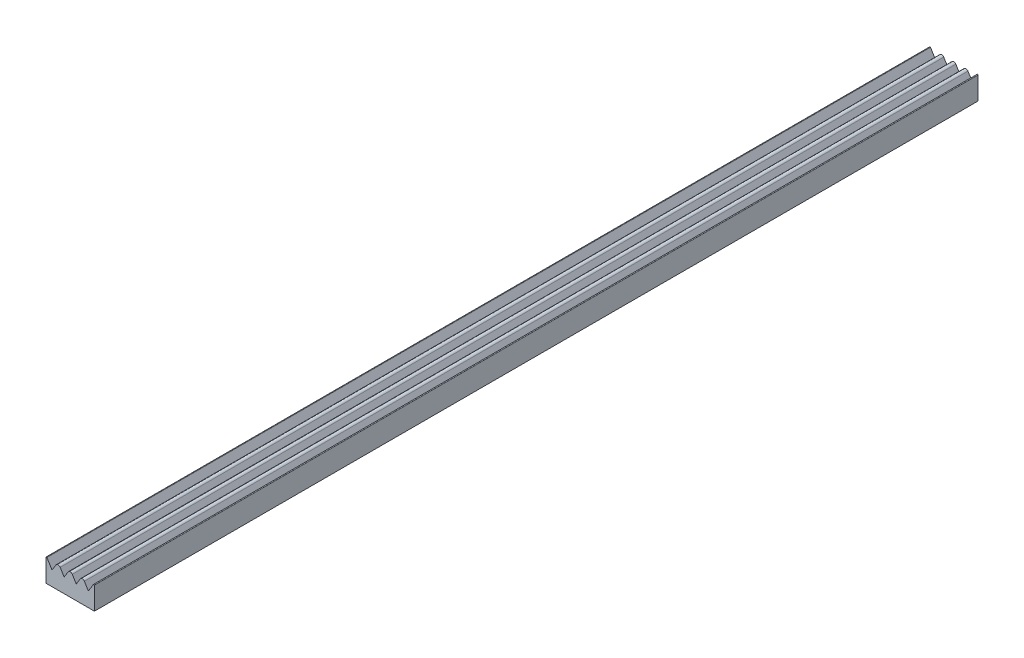
ISO-10303-21;
HEADER;
FILE_DESCRIPTION(('STEP AP214'),'2;1');
FILE_NAME('part.step','',(''),(''),'','','');
FILE_SCHEMA(('AUTOMOTIVE_DESIGN { 1 0 10303 214 1 1 1 1 }'));
ENDSEC;
DATA;
#1=APPLICATION_CONTEXT('core data for automotive mechanical design processes');
#2=APPLICATION_PROTOCOL_DEFINITION('international standard','automotive_design',2000,#1);
#3=PRODUCT_CONTEXT('',#1,'mechanical');
#4=PRODUCT('Part','Part','',(#3));
#5=PRODUCT_RELATED_PRODUCT_CATEGORY('part','',(#4));
#6=PRODUCT_DEFINITION_FORMATION('','',#4);
#7=PRODUCT_DEFINITION_CONTEXT('part definition',#1,'design');
#8=PRODUCT_DEFINITION('design','',#6,#7);
#9=PRODUCT_DEFINITION_SHAPE('','',#8);
#10=(LENGTH_UNIT() NAMED_UNIT(*) SI_UNIT(.MILLI.,.METRE.));
#11=(NAMED_UNIT(*) PLANE_ANGLE_UNIT() SI_UNIT($,.RADIAN.));
#12=(NAMED_UNIT(*) SI_UNIT($,.STERADIAN.) SOLID_ANGLE_UNIT());
#13=UNCERTAINTY_MEASURE_WITH_UNIT(LENGTH_MEASURE(1.E-05),#10,'distance_accuracy_value','');
#14=(GEOMETRIC_REPRESENTATION_CONTEXT(3) GLOBAL_UNCERTAINTY_ASSIGNED_CONTEXT((#13)) GLOBAL_UNIT_ASSIGNED_CONTEXT((#10,
#11,#12)) REPRESENTATION_CONTEXT('',''));
#15=CARTESIAN_POINT('',(0.,0.,0.));
#16=DIRECTION('',(0.,0.,1.));
#17=DIRECTION('',(1.,0.,0.));
#18=AXIS2_PLACEMENT_3D('',#15,#16,#17);
#19=CARTESIAN_POINT('',(0.,0.,231.775));
#20=DIRECTION('',(-1.,0.,0.));
#21=DIRECTION('',(0.,0.,1.));
#22=AXIS2_PLACEMENT_3D('',#19,#20,#21);
#23=PLANE('',#22);
#24=DIRECTION('',(0.,1.,0.));
#25=VECTOR('',#24,1.);
#26=CARTESIAN_POINT('',(0.,0.,0.));
#27=LINE('',#26,#25);
#28=CARTESIAN_POINT('',(0.,0.,0.));
#29=VERTEX_POINT('',#28);
#30=CARTESIAN_POINT('',(0.,5.90717687924576,0.));
#31=VERTEX_POINT('',#30);
#32=EDGE_CURVE('E177',#29,#31,#27,.T.);
#33=ORIENTED_EDGE('',*,*,#32,.T.);
#34=DIRECTION('',(0.,0.,-1.));
#35=VECTOR('',#34,1.);
#36=CARTESIAN_POINT('',(0.,5.90717687924576,231.775));
#37=LINE('',#36,#35);
#38=CARTESIAN_POINT('',(0.,5.90717687924576,231.775));
#39=VERTEX_POINT('',#38);
#40=EDGE_CURVE('E11',#39,#31,#37,.T.);
#41=ORIENTED_EDGE('',*,*,#40,.F.);
#42=DIRECTION('',(0.,1.,0.));
#43=VECTOR('',#42,1.);
#44=CARTESIAN_POINT('',(0.,0.,231.775));
#45=LINE('',#44,#43);
#46=CARTESIAN_POINT('',(0.,0.,231.775));
#47=VERTEX_POINT('',#46);
#48=EDGE_CURVE('E207',#47,#39,#45,.T.);
#49=ORIENTED_EDGE('',*,*,#48,.F.);
#50=DIRECTION('',(0.,0.,-1.));
#51=VECTOR('',#50,1.);
#52=CARTESIAN_POINT('',(0.,0.,231.775));
#53=LINE('',#52,#51);
#54=EDGE_CURVE('E173',#47,#29,#53,.T.);
#55=ORIENTED_EDGE('',*,*,#54,.T.);
#56=EDGE_LOOP('',(#33,#41,#49,#55));
#57=FACE_BOUND('',#56,.T.);
#58=ADVANCED_FACE('F33',(#57),#23,.F.);
#59=CARTESIAN_POINT('',(-0.127,5.90717687924576,231.775));
#60=DIRECTION('',(0.,0.,-1.));
#61=DIRECTION('',(-1.,0.,0.));
#62=AXIS2_PLACEMENT_3D('',#59,#60,#61);
#63=CYLINDRICAL_SURFACE('',#62,0.127);
#64=CARTESIAN_POINT('',(-0.127,5.90717687924576,0.));
#65=DIRECTION('',(0.,0.,1.));
#66=DIRECTION('',(1.,0.,0.));
#67=AXIS2_PLACEMENT_3D('',#64,#65,#66);
#68=CIRCLE('',#67,0.127);
#69=CARTESIAN_POINT('',(-0.234695784608649,5.97448674462616,0.));
#70=VERTEX_POINT('',#69);
#71=EDGE_CURVE('E180',#31,#70,#68,.T.);
#72=ORIENTED_EDGE('',*,*,#71,.T.);
#73=DIRECTION('',(0.,0.,-1.));
#74=VECTOR('',#73,1.);
#75=CARTESIAN_POINT('',(-0.234695784608649,5.97448674462616,231.775));
#76=LINE('',#75,#74);
#77=CARTESIAN_POINT('',(-0.234695784608649,5.97448674462616,231.775));
#78=VERTEX_POINT('',#77);
#79=EDGE_CURVE('E41',#78,#70,#76,.T.);
#80=ORIENTED_EDGE('',*,*,#79,.F.);
#81=CARTESIAN_POINT('',(-0.127,5.90717687924576,231.775));
#82=DIRECTION('',(0.,0.,1.));
#83=DIRECTION('',(1.,0.,0.));
#84=AXIS2_PLACEMENT_3D('',#81,#82,#83);
#85=CIRCLE('',#84,0.127);
#86=EDGE_CURVE('E116',#39,#78,#85,.T.);
#87=ORIENTED_EDGE('',*,*,#86,.F.);
#88=ORIENTED_EDGE('',*,*,#40,.T.);
#89=EDGE_LOOP('',(#72,#80,#87,#88));
#90=FACE_BOUND('',#89,.T.);
#91=ADVANCED_FACE('F305',(#90),#63,.T.);
#92=CARTESIAN_POINT('',(-1.5875,3.81,231.775));
#93=DIRECTION('',(0.847998304005088,-0.529998940003179,0.));
#94=DIRECTION('',(0.52999894000318,0.847998304005088,0.));
#95=AXIS2_PLACEMENT_3D('',#92,#93,#94);
#96=PLANE('',#95);
#97=DIRECTION('',(-0.529998940003179,-0.847998304005088,0.));
#98=VECTOR('',#97,1.);
#99=CARTESIAN_POINT('',(-1.5875,3.81,0.));
#100=LINE('',#99,#98);
#101=CARTESIAN_POINT('',(-1.5875,3.81,0.));
#102=VERTEX_POINT('',#101);
#103=EDGE_CURVE('E182',#70,#102,#100,.T.);
#104=ORIENTED_EDGE('',*,*,#103,.T.);
#105=DIRECTION('',(0.,0.,-1.));
#106=VECTOR('',#105,1.);
#107=CARTESIAN_POINT('',(-1.5875,3.81,231.775));
#108=LINE('',#107,#106);
#109=CARTESIAN_POINT('',(-1.5875,3.81,231.775));
#110=VERTEX_POINT('',#109);
#111=EDGE_CURVE('E238',#110,#102,#108,.T.);
#112=ORIENTED_EDGE('',*,*,#111,.F.);
#113=DIRECTION('',(-0.529998940003179,-0.847998304005088,0.));
#114=VECTOR('',#113,1.);
#115=CARTESIAN_POINT('',(-1.5875,3.81,231.775));
#116=LINE('',#115,#114);
#117=EDGE_CURVE('E246',#78,#110,#116,.T.);
#118=ORIENTED_EDGE('',*,*,#117,.F.);
#119=ORIENTED_EDGE('',*,*,#79,.T.);
#120=EDGE_LOOP('',(#104,#112,#118,#119));
#121=FACE_BOUND('',#120,.T.);
#122=ADVANCED_FACE('F244',(#121),#96,.F.);
#123=CARTESIAN_POINT('',(-2.63652107695677,5.48843372313082,231.775));
#124=DIRECTION('',(-0.847998304005088,-0.52999894000318,0.));
#125=DIRECTION('',(0.52999894000318,-0.847998304005088,0.));
#126=AXIS2_PLACEMENT_3D('',#123,#124,#125);
#127=PLANE('',#126);
#128=DIRECTION('',(-0.52999894000318,0.847998304005088,0.));
#129=VECTOR('',#128,1.);
#130=CARTESIAN_POINT('',(-2.63652107695677,5.48843372313082,0.));
#131=LINE('',#130,#129);
#132=CARTESIAN_POINT('',(-2.63652107695677,5.48843372313082,0.));
#133=VERTEX_POINT('',#132);
#134=EDGE_CURVE('E184',#102,#133,#131,.T.);
#135=ORIENTED_EDGE('',*,*,#134,.T.);
#136=DIRECTION('',(0.,0.,-1.));
#137=VECTOR('',#136,1.);
#138=CARTESIAN_POINT('',(-2.63652107695677,5.48843372313082,231.775));
#139=LINE('',#138,#137);
#140=CARTESIAN_POINT('',(-2.63652107695677,5.48843372313082,231.775));
#141=VERTEX_POINT('',#140);
#142=EDGE_CURVE('E235',#141,#133,#139,.T.);
#143=ORIENTED_EDGE('',*,*,#142,.F.);
#144=DIRECTION('',(-0.52999894000318,0.847998304005088,0.));
#145=VECTOR('',#144,1.);
#146=CARTESIAN_POINT('',(-2.63652107695677,5.48843372313082,231.775));
#147=LINE('',#146,#145);
#148=EDGE_CURVE('E264',#110,#141,#147,.T.);
#149=ORIENTED_EDGE('',*,*,#148,.F.);
#150=ORIENTED_EDGE('',*,*,#111,.T.);
#151=EDGE_LOOP('',(#135,#143,#149,#150));
#152=FACE_BOUND('',#151,.T.);
#153=ADVANCED_FACE('F255',(#152),#127,.F.);
#154=CARTESIAN_POINT('',(-3.175,5.15188439622881,231.775));
#155=DIRECTION('',(0.,0.,-1.));
#156=DIRECTION('',(-1.,0.,0.));
#157=AXIS2_PLACEMENT_3D('',#154,#155,#156);
#158=CYLINDRICAL_SURFACE('',#157,0.635);
#159=CARTESIAN_POINT('',(-3.175,5.15188439622881,0.));
#160=DIRECTION('',(0.,0.,1.));
#161=DIRECTION('',(-1.,0.,0.));
#162=AXIS2_PLACEMENT_3D('',#159,#160,#161);
#163=CIRCLE('',#162,0.635);
#164=CARTESIAN_POINT('',(-3.71347892304324,5.48843372313082,0.));
#165=VERTEX_POINT('',#164);
#166=EDGE_CURVE('E186',#133,#165,#163,.T.);
#167=ORIENTED_EDGE('',*,*,#166,.T.);
#168=DIRECTION('',(0.,0.,-1.));
#169=VECTOR('',#168,1.);
#170=CARTESIAN_POINT('',(-3.71347892304324,5.48843372313082,231.775));
#171=LINE('',#170,#169);
#172=CARTESIAN_POINT('',(-3.71347892304324,5.48843372313082,231.775));
#173=VERTEX_POINT('',#172);
#174=EDGE_CURVE('E232',#173,#165,#171,.T.);
#175=ORIENTED_EDGE('',*,*,#174,.F.);
#176=CARTESIAN_POINT('',(-3.175,5.15188439622881,231.775));
#177=DIRECTION('',(0.,0.,1.));
#178=DIRECTION('',(-1.,0.,0.));
#179=AXIS2_PLACEMENT_3D('',#176,#177,#178);
#180=CIRCLE('',#179,0.635);
#181=EDGE_CURVE('E261',#141,#173,#180,.T.);
#182=ORIENTED_EDGE('',*,*,#181,.F.);
#183=ORIENTED_EDGE('',*,*,#142,.T.);
#184=EDGE_LOOP('',(#167,#175,#182,#183));
#185=FACE_BOUND('',#184,.T.);
#186=ADVANCED_FACE('F259',(#185),#158,.T.);
#187=CARTESIAN_POINT('',(-4.7625,3.81,231.775));
#188=DIRECTION('',(0.847998304005088,-0.52999894000318,0.));
#189=DIRECTION('',(0.52999894000318,0.847998304005088,0.));
#190=AXIS2_PLACEMENT_3D('',#187,#188,#189);
#191=PLANE('',#190);
#192=DIRECTION('',(-0.52999894000318,-0.847998304005088,0.));
#193=VECTOR('',#192,1.);
#194=CARTESIAN_POINT('',(-4.7625,3.81,0.));
#195=LINE('',#194,#193);
#196=CARTESIAN_POINT('',(-4.7625,3.81,0.));
#197=VERTEX_POINT('',#196);
#198=EDGE_CURVE('E188',#165,#197,#195,.T.);
#199=ORIENTED_EDGE('',*,*,#198,.T.);
#200=DIRECTION('',(0.,0.,-1.));
#201=VECTOR('',#200,1.);
#202=CARTESIAN_POINT('',(-4.7625,3.81,231.775));
#203=LINE('',#202,#201);
#204=CARTESIAN_POINT('',(-4.7625,3.81,231.775));
#205=VERTEX_POINT('',#204);
#206=EDGE_CURVE('E229',#205,#197,#203,.T.);
#207=ORIENTED_EDGE('',*,*,#206,.F.);
#208=DIRECTION('',(-0.52999894000318,-0.847998304005088,0.));
#209=VECTOR('',#208,1.);
#210=CARTESIAN_POINT('',(-4.7625,3.81,231.775));
#211=LINE('',#210,#209);
#212=EDGE_CURVE('E263',#173,#205,#211,.T.);
#213=ORIENTED_EDGE('',*,*,#212,.F.);
#214=ORIENTED_EDGE('',*,*,#174,.T.);
#215=EDGE_LOOP('',(#199,#207,#213,#214));
#216=FACE_BOUND('',#215,.T.);
#217=ADVANCED_FACE('F318',(#216),#191,.F.);
#218=CARTESIAN_POINT('',(-4.7625,3.81,231.775));
#219=DIRECTION('',(-0.847998304005088,-0.52999894000318,0.));
#220=DIRECTION('',(0.52999894000318,-0.847998304005088,0.));
#221=AXIS2_PLACEMENT_3D('',#218,#219,#220);
#222=PLANE('',#221);
#223=DIRECTION('',(-0.52999894000318,0.847998304005088,0.));
#224=VECTOR('',#223,1.);
#225=CARTESIAN_POINT('',(-4.7625,3.81,0.));
#226=LINE('',#225,#224);
#227=CARTESIAN_POINT('',(-5.81152107695676,5.48843372313082,0.));
#228=VERTEX_POINT('',#227);
#229=EDGE_CURVE('E190',#197,#228,#226,.T.);
#230=ORIENTED_EDGE('',*,*,#229,.T.);
#231=DIRECTION('',(0.,0.,-1.));
#232=VECTOR('',#231,1.);
#233=CARTESIAN_POINT('',(-5.81152107695676,5.48843372313082,231.775));
#234=LINE('',#233,#232);
#235=CARTESIAN_POINT('',(-5.81152107695676,5.48843372313082,231.775));
#236=VERTEX_POINT('',#235);
#237=EDGE_CURVE('E226',#236,#228,#234,.T.);
#238=ORIENTED_EDGE('',*,*,#237,.F.);
#239=DIRECTION('',(-0.52999894000318,0.847998304005088,0.));
#240=VECTOR('',#239,1.);
#241=CARTESIAN_POINT('',(-4.7625,3.81,231.775));
#242=LINE('',#241,#240);
#243=EDGE_CURVE('E266',#205,#236,#242,.T.);
#244=ORIENTED_EDGE('',*,*,#243,.F.);
#245=ORIENTED_EDGE('',*,*,#206,.T.);
#246=EDGE_LOOP('',(#230,#238,#244,#245));
#247=FACE_BOUND('',#246,.T.);
#248=ADVANCED_FACE('F321',(#247),#222,.F.);
#249=CARTESIAN_POINT('',(-6.35,5.15188439622881,231.775));
#250=DIRECTION('',(0.,0.,-1.));
#251=DIRECTION('',(-1.,0.,0.));
#252=AXIS2_PLACEMENT_3D('',#249,#250,#251);
#253=CYLINDRICAL_SURFACE('',#252,0.635);
#254=CARTESIAN_POINT('',(-6.35,5.15188439622881,0.));
#255=DIRECTION('',(0.,0.,1.));
#256=DIRECTION('',(-1.,0.,0.));
#257=AXIS2_PLACEMENT_3D('',#254,#255,#256);
#258=CIRCLE('',#257,0.635);
#259=CARTESIAN_POINT('',(-6.88847892304323,5.48843372313082,0.));
#260=VERTEX_POINT('',#259);
#261=EDGE_CURVE('E192',#228,#260,#258,.T.);
#262=ORIENTED_EDGE('',*,*,#261,.T.);
#263=DIRECTION('',(0.,0.,-1.));
#264=VECTOR('',#263,1.);
#265=CARTESIAN_POINT('',(-6.88847892304323,5.48843372313082,231.775));
#266=LINE('',#265,#264);
#267=CARTESIAN_POINT('',(-6.88847892304323,5.48843372313082,231.775));
#268=VERTEX_POINT('',#267);
#269=EDGE_CURVE('E223',#268,#260,#266,.T.);
#270=ORIENTED_EDGE('',*,*,#269,.F.);
#271=CARTESIAN_POINT('',(-6.35,5.15188439622881,231.775));
#272=DIRECTION('',(0.,0.,1.));
#273=DIRECTION('',(-1.,0.,0.));
#274=AXIS2_PLACEMENT_3D('',#271,#272,#273);
#275=CIRCLE('',#274,0.635);
#276=EDGE_CURVE('E272',#236,#268,#275,.T.);
#277=ORIENTED_EDGE('',*,*,#276,.F.);
#278=ORIENTED_EDGE('',*,*,#237,.T.);
#279=EDGE_LOOP('',(#262,#270,#277,#278));
#280=FACE_BOUND('',#279,.T.);
#281=ADVANCED_FACE('F325',(#280),#253,.T.);
#282=CARTESIAN_POINT('',(-7.9375,3.81,231.775));
#283=DIRECTION('',(0.847998304005088,-0.52999894000318,0.));
#284=DIRECTION('',(0.52999894000318,0.847998304005088,0.));
#285=AXIS2_PLACEMENT_3D('',#282,#283,#284);
#286=PLANE('',#285);
#287=DIRECTION('',(-0.52999894000318,-0.847998304005088,0.));
#288=VECTOR('',#287,1.);
#289=CARTESIAN_POINT('',(-7.9375,3.81,0.));
#290=LINE('',#289,#288);
#291=CARTESIAN_POINT('',(-7.9375,3.81,0.));
#292=VERTEX_POINT('',#291);
#293=EDGE_CURVE('E194',#260,#292,#290,.T.);
#294=ORIENTED_EDGE('',*,*,#293,.T.);
#295=DIRECTION('',(0.,0.,-1.));
#296=VECTOR('',#295,1.);
#297=CARTESIAN_POINT('',(-7.9375,3.81,231.775));
#298=LINE('',#297,#296);
#299=CARTESIAN_POINT('',(-7.9375,3.81,231.775));
#300=VERTEX_POINT('',#299);
#301=EDGE_CURVE('E220',#300,#292,#298,.T.);
#302=ORIENTED_EDGE('',*,*,#301,.F.);
#303=DIRECTION('',(-0.52999894000318,-0.847998304005088,0.));
#304=VECTOR('',#303,1.);
#305=CARTESIAN_POINT('',(-7.9375,3.81,231.775));
#306=LINE('',#305,#304);
#307=EDGE_CURVE('E274',#268,#300,#306,.T.);
#308=ORIENTED_EDGE('',*,*,#307,.F.);
#309=ORIENTED_EDGE('',*,*,#269,.T.);
#310=EDGE_LOOP('',(#294,#302,#308,#309));
#311=FACE_BOUND('',#310,.T.);
#312=ADVANCED_FACE('F329',(#311),#286,.F.);
#313=CARTESIAN_POINT('',(-7.9375,3.81,231.775));
#314=DIRECTION('',(-0.847998304005088,-0.52999894000318,0.));
#315=DIRECTION('',(0.52999894000318,-0.847998304005088,0.));
#316=AXIS2_PLACEMENT_3D('',#313,#314,#315);
#317=PLANE('',#316);
#318=DIRECTION('',(-0.52999894000318,0.847998304005088,0.));
#319=VECTOR('',#318,1.);
#320=CARTESIAN_POINT('',(-7.9375,3.81,0.));
#321=LINE('',#320,#319);
#322=CARTESIAN_POINT('',(-8.98652107695676,5.48843372313082,0.));
#323=VERTEX_POINT('',#322);
#324=EDGE_CURVE('E196',#292,#323,#321,.T.);
#325=ORIENTED_EDGE('',*,*,#324,.T.);
#326=DIRECTION('',(0.,0.,-1.));
#327=VECTOR('',#326,1.);
#328=CARTESIAN_POINT('',(-8.98652107695676,5.48843372313082,231.775));
#329=LINE('',#328,#327);
#330=CARTESIAN_POINT('',(-8.98652107695676,5.48843372313082,231.775));
#331=VERTEX_POINT('',#330);
#332=EDGE_CURVE('E217',#331,#323,#329,.T.);
#333=ORIENTED_EDGE('',*,*,#332,.F.);
#334=DIRECTION('',(-0.52999894000318,0.847998304005088,0.));
#335=VECTOR('',#334,1.);
#336=CARTESIAN_POINT('',(-7.9375,3.81,231.775));
#337=LINE('',#336,#335);
#338=EDGE_CURVE('E276',#300,#331,#337,.T.);
#339=ORIENTED_EDGE('',*,*,#338,.F.);
#340=ORIENTED_EDGE('',*,*,#301,.T.);
#341=EDGE_LOOP('',(#325,#333,#339,#340));
#342=FACE_BOUND('',#341,.T.);
#343=ADVANCED_FACE('F333',(#342),#317,.F.);
#344=CARTESIAN_POINT('',(-9.525,5.15188439622881,231.775));
#345=DIRECTION('',(0.,0.,-1.));
#346=DIRECTION('',(-1.,0.,0.));
#347=AXIS2_PLACEMENT_3D('',#344,#345,#346);
#348=CYLINDRICAL_SURFACE('',#347,0.635);
#349=CARTESIAN_POINT('',(-9.525,5.15188439622881,0.));
#350=DIRECTION('',(0.,0.,1.));
#351=DIRECTION('',(1.,0.,0.));
#352=AXIS2_PLACEMENT_3D('',#349,#350,#351);
#353=CIRCLE('',#352,0.635);
#354=CARTESIAN_POINT('',(-10.0634789230432,5.48843372313082,0.));
#355=VERTEX_POINT('',#354);
#356=EDGE_CURVE('E198',#323,#355,#353,.T.);
#357=ORIENTED_EDGE('',*,*,#356,.T.);
#358=DIRECTION('',(0.,0.,-1.));
#359=VECTOR('',#358,1.);
#360=CARTESIAN_POINT('',(-10.0634789230432,5.48843372313082,231.775));
#361=LINE('',#360,#359);
#362=CARTESIAN_POINT('',(-10.0634789230432,5.48843372313082,231.775));
#363=VERTEX_POINT('',#362);
#364=EDGE_CURVE('E214',#363,#355,#361,.T.);
#365=ORIENTED_EDGE('',*,*,#364,.F.);
#366=CARTESIAN_POINT('',(-9.525,5.15188439622881,231.775));
#367=DIRECTION('',(0.,0.,1.));
#368=DIRECTION('',(1.,0.,0.));
#369=AXIS2_PLACEMENT_3D('',#366,#367,#368);
#370=CIRCLE('',#369,0.635);
#371=EDGE_CURVE('E278',#331,#363,#370,.T.);
#372=ORIENTED_EDGE('',*,*,#371,.F.);
#373=ORIENTED_EDGE('',*,*,#332,.T.);
#374=EDGE_LOOP('',(#357,#365,#372,#373));
#375=FACE_BOUND('',#374,.T.);
#376=ADVANCED_FACE('F337',(#375),#348,.T.);
#377=CARTESIAN_POINT('',(-10.0634789230432,5.48843372313082,231.775));
#378=DIRECTION('',(0.847998304005088,-0.52999894000318,0.));
#379=DIRECTION('',(0.52999894000318,0.847998304005088,0.));
#380=AXIS2_PLACEMENT_3D('',#377,#378,#379);
#381=PLANE('',#380);
#382=DIRECTION('',(-0.52999894000318,-0.847998304005088,0.));
#383=VECTOR('',#382,1.);
#384=CARTESIAN_POINT('',(-10.0634789230432,5.48843372313082,0.));
#385=LINE('',#384,#383);
#386=CARTESIAN_POINT('',(-11.1125,3.81,0.));
#387=VERTEX_POINT('',#386);
#388=EDGE_CURVE('E200',#355,#387,#385,.T.);
#389=ORIENTED_EDGE('',*,*,#388,.T.);
#390=DIRECTION('',(0.,0.,-1.));
#391=VECTOR('',#390,1.);
#392=CARTESIAN_POINT('',(-11.1125,3.81,231.775));
#393=LINE('',#392,#391);
#394=CARTESIAN_POINT('',(-11.1125,3.81,231.775));
#395=VERTEX_POINT('',#394);
#396=EDGE_CURVE('E211',#395,#387,#393,.T.);
#397=ORIENTED_EDGE('',*,*,#396,.F.);
#398=DIRECTION('',(-0.52999894000318,-0.847998304005088,0.));
#399=VECTOR('',#398,1.);
#400=CARTESIAN_POINT('',(-10.0634789230432,5.48843372313082,231.775));
#401=LINE('',#400,#399);
#402=EDGE_CURVE('E280',#363,#395,#401,.T.);
#403=ORIENTED_EDGE('',*,*,#402,.F.);
#404=ORIENTED_EDGE('',*,*,#364,.T.);
#405=EDGE_LOOP('',(#389,#397,#403,#404));
#406=FACE_BOUND('',#405,.T.);
#407=ADVANCED_FACE('F286',(#406),#381,.F.);
#408=CARTESIAN_POINT('',(-11.1125,3.81,231.775));
#409=DIRECTION('',(-0.847998304005088,-0.52999894000318,0.));
#410=DIRECTION('',(0.52999894000318,-0.847998304005088,0.));
#411=AXIS2_PLACEMENT_3D('',#408,#409,#410);
#412=PLANE('',#411);
#413=DIRECTION('',(-0.52999894000318,0.847998304005088,0.));
#414=VECTOR('',#413,1.);
#415=CARTESIAN_POINT('',(-11.1125,3.81,0.));
#416=LINE('',#415,#414);
#417=CARTESIAN_POINT('',(-12.4653042153914,5.97448674462616,0.));
#418=VERTEX_POINT('',#417);
#419=EDGE_CURVE('E202',#387,#418,#416,.T.);
#420=ORIENTED_EDGE('',*,*,#419,.T.);
#421=DIRECTION('',(0.,0.,-1.));
#422=VECTOR('',#421,1.);
#423=CARTESIAN_POINT('',(-12.4653042153914,5.97448674462616,231.775));
#424=LINE('',#423,#422);
#425=CARTESIAN_POINT('',(-12.4653042153914,5.97448674462616,231.775));
#426=VERTEX_POINT('',#425);
#427=EDGE_CURVE('E168',#426,#418,#424,.T.);
#428=ORIENTED_EDGE('',*,*,#427,.F.);
#429=DIRECTION('',(-0.52999894000318,0.847998304005088,0.));
#430=VECTOR('',#429,1.);
#431=CARTESIAN_POINT('',(-11.1125,3.81,231.775));
#432=LINE('',#431,#430);
#433=EDGE_CURVE('E159',#395,#426,#432,.T.);
#434=ORIENTED_EDGE('',*,*,#433,.F.);
#435=ORIENTED_EDGE('',*,*,#396,.T.);
#436=EDGE_LOOP('',(#420,#428,#434,#435));
#437=FACE_BOUND('',#436,.T.);
#438=ADVANCED_FACE('F290',(#437),#412,.F.);
#439=CARTESIAN_POINT('',(-12.573,5.90717687924576,231.775));
#440=DIRECTION('',(0.,0.,-1.));
#441=DIRECTION('',(-1.,0.,0.));
#442=AXIS2_PLACEMENT_3D('',#439,#440,#441);
#443=CYLINDRICAL_SURFACE('',#442,0.127);
#444=CARTESIAN_POINT('',(-12.573,5.90717687924576,0.));
#445=DIRECTION('',(0.,0.,1.));
#446=DIRECTION('',(1.,0.,0.));
#447=AXIS2_PLACEMENT_3D('',#444,#445,#446);
#448=CIRCLE('',#447,0.127);
#449=CARTESIAN_POINT('',(-12.7,5.90717687924575,0.));
#450=VERTEX_POINT('',#449);
#451=EDGE_CURVE('E167',#418,#450,#448,.T.);
#452=ORIENTED_EDGE('',*,*,#451,.T.);
#453=DIRECTION('',(0.,0.,-1.));
#454=VECTOR('',#453,1.);
#455=CARTESIAN_POINT('',(-12.7,5.90717687924575,231.775));
#456=LINE('',#455,#454);
#457=CARTESIAN_POINT('',(-12.7,5.90717687924575,231.775));
#458=VERTEX_POINT('',#457);
#459=EDGE_CURVE('E164',#458,#450,#456,.T.);
#460=ORIENTED_EDGE('',*,*,#459,.F.);
#461=CARTESIAN_POINT('',(-12.573,5.90717687924576,231.775));
#462=DIRECTION('',(0.,0.,1.));
#463=DIRECTION('',(1.,0.,0.));
#464=AXIS2_PLACEMENT_3D('',#461,#462,#463);
#465=CIRCLE('',#464,0.127);
#466=EDGE_CURVE('E153',#426,#458,#465,.T.);
#467=ORIENTED_EDGE('',*,*,#466,.F.);
#468=ORIENTED_EDGE('',*,*,#427,.T.);
#469=EDGE_LOOP('',(#452,#460,#467,#468));
#470=FACE_BOUND('',#469,.T.);
#471=ADVANCED_FACE('F165',(#470),#443,.T.);
#472=CARTESIAN_POINT('',(-12.7,0.,231.775));
#473=DIRECTION('',(1.,0.,0.));
#474=DIRECTION('',(0.,0.,-1.));
#475=AXIS2_PLACEMENT_3D('',#472,#473,#474);
#476=PLANE('',#475);
#477=DIRECTION('',(0.,-1.,0.));
#478=VECTOR('',#477,1.);
#479=CARTESIAN_POINT('',(-12.7,0.,0.));
#480=LINE('',#479,#478);
#481=CARTESIAN_POINT('',(-12.7,0.,0.));
#482=VERTEX_POINT('',#481);
#483=EDGE_CURVE('E102',#450,#482,#480,.T.);
#484=ORIENTED_EDGE('',*,*,#483,.T.);
#485=DIRECTION('',(0.,0.,-1.));
#486=VECTOR('',#485,1.);
#487=CARTESIAN_POINT('',(-12.7,0.,231.775));
#488=LINE('',#487,#486);
#489=CARTESIAN_POINT('',(-12.7,0.,231.775));
#490=VERTEX_POINT('',#489);
#491=EDGE_CURVE('E169',#490,#482,#488,.T.);
#492=ORIENTED_EDGE('',*,*,#491,.F.);
#493=DIRECTION('',(0.,-1.,0.));
#494=VECTOR('',#493,1.);
#495=CARTESIAN_POINT('',(-12.7,0.,231.775));
#496=LINE('',#495,#494);
#497=EDGE_CURVE('E157',#458,#490,#496,.T.);
#498=ORIENTED_EDGE('',*,*,#497,.F.);
#499=ORIENTED_EDGE('',*,*,#459,.T.);
#500=EDGE_LOOP('',(#484,#492,#498,#499));
#501=FACE_BOUND('',#500,.T.);
#502=ADVANCED_FACE('F171',(#501),#476,.F.);
#503=CARTESIAN_POINT('',(0.,0.,231.775));
#504=DIRECTION('',(0.,1.,0.));
#505=DIRECTION('',(-1.,0.,0.));
#506=AXIS2_PLACEMENT_3D('',#503,#504,#505);
#507=PLANE('',#506);
#508=DIRECTION('',(1.,0.,0.));
#509=VECTOR('',#508,1.);
#510=CARTESIAN_POINT('',(0.,0.,0.));
#511=LINE('',#510,#509);
#512=EDGE_CURVE('E108',#482,#29,#511,.T.);
#513=ORIENTED_EDGE('',*,*,#512,.T.);
#514=ORIENTED_EDGE('',*,*,#54,.F.);
#515=DIRECTION('',(1.,0.,0.));
#516=VECTOR('',#515,1.);
#517=CARTESIAN_POINT('',(0.,0.,231.775));
#518=LINE('',#517,#516);
#519=EDGE_CURVE('E49',#490,#47,#518,.T.);
#520=ORIENTED_EDGE('',*,*,#519,.F.);
#521=ORIENTED_EDGE('',*,*,#491,.T.);
#522=EDGE_LOOP('',(#513,#514,#520,#521));
#523=FACE_BOUND('',#522,.T.);
#524=ADVANCED_FACE('F294',(#523),#507,.F.);
#525=CARTESIAN_POINT('',(-0.127,5.90717687924576,231.775));
#526=DIRECTION('',(0.,0.,1.));
#527=DIRECTION('',(1.,0.,0.));
#528=AXIS2_PLACEMENT_3D('',#525,#526,#527);
#529=PLANE('',#528);
#530=ORIENTED_EDGE('',*,*,#48,.T.);
#531=ORIENTED_EDGE('',*,*,#86,.T.);
#532=ORIENTED_EDGE('',*,*,#117,.T.);
#533=ORIENTED_EDGE('',*,*,#148,.T.);
#534=ORIENTED_EDGE('',*,*,#181,.T.);
#535=ORIENTED_EDGE('',*,*,#212,.T.);
#536=ORIENTED_EDGE('',*,*,#243,.T.);
#537=ORIENTED_EDGE('',*,*,#276,.T.);
#538=ORIENTED_EDGE('',*,*,#307,.T.);
#539=ORIENTED_EDGE('',*,*,#338,.T.);
#540=ORIENTED_EDGE('',*,*,#371,.T.);
#541=ORIENTED_EDGE('',*,*,#402,.T.);
#542=ORIENTED_EDGE('',*,*,#433,.T.);
#543=ORIENTED_EDGE('',*,*,#466,.T.);
#544=ORIENTED_EDGE('',*,*,#497,.T.);
#545=ORIENTED_EDGE('',*,*,#519,.T.);
#546=EDGE_LOOP('',(#530,#531,#532,#533,#534,#535,#536,#537,#538,#539,#540,#541,#542,#543,#544,#545));
#547=FACE_BOUND('',#546,.T.);
#548=ADVANCED_FACE('F155',(#547),#529,.T.);
#549=CARTESIAN_POINT('',(-0.127,5.90717687924576,0.));
#550=DIRECTION('',(0.,0.,1.));
#551=DIRECTION('',(1.,0.,0.));
#552=AXIS2_PLACEMENT_3D('',#549,#550,#551);
#553=PLANE('',#552);
#554=ORIENTED_EDGE('',*,*,#32,.F.);
#555=ORIENTED_EDGE('',*,*,#512,.F.);
#556=ORIENTED_EDGE('',*,*,#483,.F.);
#557=ORIENTED_EDGE('',*,*,#451,.F.);
#558=ORIENTED_EDGE('',*,*,#419,.F.);
#559=ORIENTED_EDGE('',*,*,#388,.F.);
#560=ORIENTED_EDGE('',*,*,#356,.F.);
#561=ORIENTED_EDGE('',*,*,#324,.F.);
#562=ORIENTED_EDGE('',*,*,#293,.F.);
#563=ORIENTED_EDGE('',*,*,#261,.F.);
#564=ORIENTED_EDGE('',*,*,#229,.F.);
#565=ORIENTED_EDGE('',*,*,#198,.F.);
#566=ORIENTED_EDGE('',*,*,#166,.F.);
#567=ORIENTED_EDGE('',*,*,#134,.F.);
#568=ORIENTED_EDGE('',*,*,#103,.F.);
#569=ORIENTED_EDGE('',*,*,#71,.F.);
#570=EDGE_LOOP('',(#554,#555,#556,#557,#558,#559,#560,#561,#562,#563,#564,#565,#566,#567,#568,#569));
#571=FACE_BOUND('',#570,.T.);
#572=ADVANCED_FACE('F250',(#571),#553,.F.);
#573=CLOSED_SHELL('',(#58,#91,#122,#153,#186,#217,#248,#281,#312,#343,#376,#407,#438,#471,#502,
#524,#548,#572));
#574=MANIFOLD_SOLID_BREP('B2',#573);
#575=ADVANCED_BREP_SHAPE_REPRESENTATION('',(#18,#574),#14);
#576=SHAPE_DEFINITION_REPRESENTATION(#9,#575);
ENDSEC;
END-ISO-10303-21;
